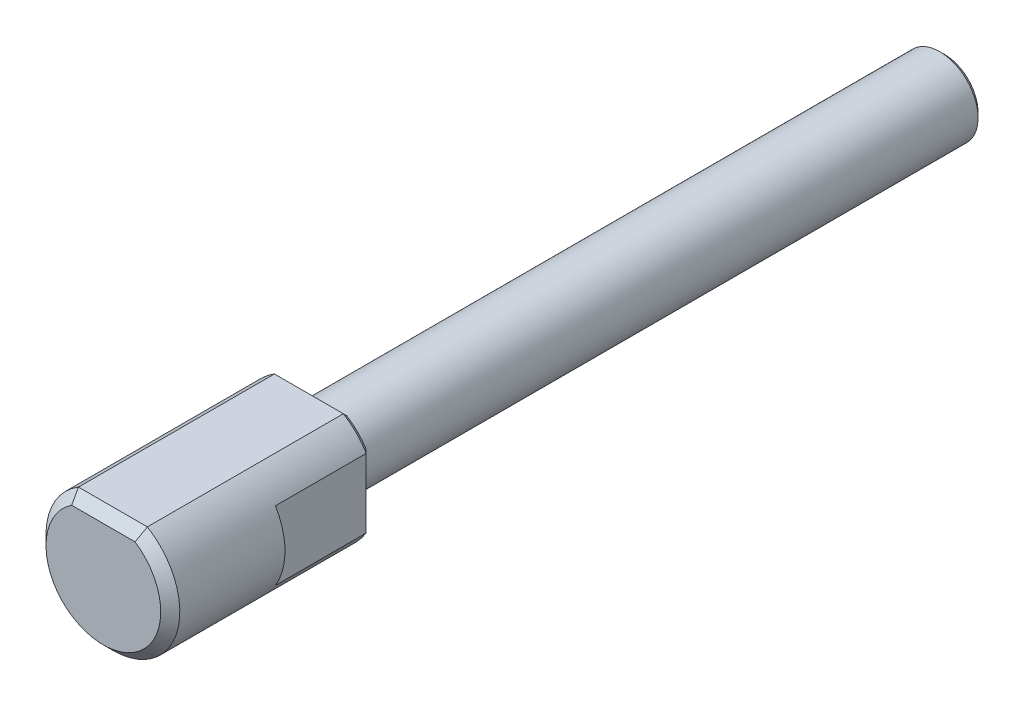
ISO-10303-21;
HEADER;
FILE_DESCRIPTION(('STEP AP214'),'2;1');
FILE_NAME('part.step','',(''),(''),'','','');
FILE_SCHEMA(('AUTOMOTIVE_DESIGN { 1 0 10303 214 1 1 1 1 }'));
ENDSEC;
DATA;
#1=APPLICATION_CONTEXT('core data for automotive mechanical design processes');
#2=APPLICATION_PROTOCOL_DEFINITION('international standard','automotive_design',2000,#1);
#3=PRODUCT_CONTEXT('',#1,'mechanical');
#4=PRODUCT('Part','Part','',(#3));
#5=PRODUCT_RELATED_PRODUCT_CATEGORY('part','',(#4));
#6=PRODUCT_DEFINITION_FORMATION('','',#4);
#7=PRODUCT_DEFINITION_CONTEXT('part definition',#1,'design');
#8=PRODUCT_DEFINITION('design','',#6,#7);
#9=PRODUCT_DEFINITION_SHAPE('','',#8);
#10=(LENGTH_UNIT() NAMED_UNIT(*) SI_UNIT(.MILLI.,.METRE.));
#11=(NAMED_UNIT(*) PLANE_ANGLE_UNIT() SI_UNIT($,.RADIAN.));
#12=(NAMED_UNIT(*) SI_UNIT($,.STERADIAN.) SOLID_ANGLE_UNIT());
#13=UNCERTAINTY_MEASURE_WITH_UNIT(LENGTH_MEASURE(1.E-05),#10,'distance_accuracy_value','');
#14=(GEOMETRIC_REPRESENTATION_CONTEXT(3) GLOBAL_UNCERTAINTY_ASSIGNED_CONTEXT((#13)) GLOBAL_UNIT_ASSIGNED_CONTEXT((#10,
#11,#12)) REPRESENTATION_CONTEXT('',''));
#15=CARTESIAN_POINT('',(0.,0.,0.));
#16=DIRECTION('',(0.,0.,1.));
#17=DIRECTION('',(1.,0.,0.));
#18=AXIS2_PLACEMENT_3D('',#15,#16,#17);
#19=CARTESIAN_POINT('',(0.,0.,76.));
#20=DIRECTION('',(0.,0.,1.));
#21=DIRECTION('',(1.,0.,0.));
#22=AXIS2_PLACEMENT_3D('',#19,#20,#21);
#23=PLANE('',#22);
#24=DIRECTION('',(0.,1.,0.));
#25=VECTOR('',#24,1.);
#26=CARTESIAN_POINT('',(-6.,3.60555127546399,76.));
#27=LINE('',#26,#25);
#28=CARTESIAN_POINT('',(-6.,-3.60555127546399,76.));
#29=VERTEX_POINT('',#28);
#30=CARTESIAN_POINT('',(-6.,3.60555127546399,76.));
#31=VERTEX_POINT('',#30);
#32=EDGE_CURVE('E148',#29,#31,#27,.T.);
#33=ORIENTED_EDGE('',*,*,#32,.F.);
#34=CARTESIAN_POINT('',(0.,0.,76.));
#35=DIRECTION('',(0.,0.,1.));
#36=DIRECTION('',(1.,0.,0.));
#37=AXIS2_PLACEMENT_3D('',#34,#35,#36);
#38=CIRCLE('',#37,7.);
#39=EDGE_CURVE('E142',#31,#29,#38,.T.);
#40=ORIENTED_EDGE('',*,*,#39,.F.);
#41=EDGE_LOOP('',(#33,#40));
#42=FACE_BOUND('',#41,.T.);
#43=ADVANCED_FACE('F33',(#42),#23,.F.);
#44=DIRECTION('',(-1.,0.,0.));
#45=VECTOR('',#44,1.);
#46=CARTESIAN_POINT('',(-3.60555127546399,-6.,76.));
#47=LINE('',#46,#45);
#48=CARTESIAN_POINT('',(3.60555127546399,-6.,76.));
#49=VERTEX_POINT('',#48);
#50=CARTESIAN_POINT('',(-3.60555127546399,-6.,76.));
#51=VERTEX_POINT('',#50);
#52=EDGE_CURVE('E144',#49,#51,#47,.T.);
#53=ORIENTED_EDGE('',*,*,#52,.F.);
#54=EDGE_CURVE('E140',#51,#49,#38,.T.);
#55=ORIENTED_EDGE('',*,*,#54,.F.);
#56=EDGE_LOOP('',(#53,#55));
#57=FACE_BOUND('',#56,.T.);
#58=ADVANCED_FACE('F285',(#57),#23,.F.);
#59=DIRECTION('',(0.,-1.,0.));
#60=VECTOR('',#59,1.);
#61=CARTESIAN_POINT('',(6.,-3.60555127546399,76.));
#62=LINE('',#61,#60);
#63=CARTESIAN_POINT('',(6.,3.60555127546399,76.));
#64=VERTEX_POINT('',#63);
#65=CARTESIAN_POINT('',(6.,-3.60555127546399,76.));
#66=VERTEX_POINT('',#65);
#67=EDGE_CURVE('E139',#64,#66,#62,.T.);
#68=ORIENTED_EDGE('',*,*,#67,.F.);
#69=EDGE_CURVE('E131',#66,#64,#38,.T.);
#70=ORIENTED_EDGE('',*,*,#69,.F.);
#71=EDGE_LOOP('',(#68,#70));
#72=FACE_BOUND('',#71,.T.);
#73=ADVANCED_FACE('F138',(#72),#23,.F.);
#74=CARTESIAN_POINT('',(0.,0.,76.));
#75=DIRECTION('',(0.,0.,1.));
#76=DIRECTION('',(1.,0.,0.));
#77=AXIS2_PLACEMENT_3D('',#74,#75,#76);
#78=CYLINDRICAL_SURFACE('',#77,7.);
#79=DIRECTION('',(0.,0.,1.));
#80=VECTOR('',#79,1.);
#81=CARTESIAN_POINT('',(-6.,-3.60555127546399,66.));
#82=LINE('',#81,#80);
#83=CARTESIAN_POINT('',(-6.,-3.60555127546399,66.5));
#84=VERTEX_POINT('',#83);
#85=EDGE_CURVE('E158',#84,#29,#82,.T.);
#86=ORIENTED_EDGE('',*,*,#85,.F.);
#87=CARTESIAN_POINT('',(0.,0.,66.5));
#88=DIRECTION('',(0.,0.,-1.));
#89=DIRECTION('',(-1.,0.,0.));
#90=AXIS2_PLACEMENT_3D('',#87,#88,#89);
#91=CIRCLE('',#90,7.);
#92=CARTESIAN_POINT('',(-3.60555127546399,-6.,66.5));
#93=VERTEX_POINT('',#92);
#94=EDGE_CURVE('E333',#84,#93,#91,.F.);
#95=ORIENTED_EDGE('',*,*,#94,.T.);
#96=DIRECTION('',(0.,0.,1.));
#97=VECTOR('',#96,1.);
#98=CARTESIAN_POINT('',(-3.60555127546399,-6.,66.));
#99=LINE('',#98,#97);
#100=EDGE_CURVE('E160',#93,#51,#99,.T.);
#101=ORIENTED_EDGE('',*,*,#100,.T.);
#102=ORIENTED_EDGE('',*,*,#54,.T.);
#103=DIRECTION('',(0.,0.,1.));
#104=VECTOR('',#103,1.);
#105=CARTESIAN_POINT('',(3.60555127546399,-6.,66.));
#106=LINE('',#105,#104);
#107=CARTESIAN_POINT('',(3.60555127546399,-6.,66.5));
#108=VERTEX_POINT('',#107);
#109=EDGE_CURVE('E134',#108,#49,#106,.T.);
#110=ORIENTED_EDGE('',*,*,#109,.F.);
#111=CARTESIAN_POINT('',(0.,0.,66.5));
#112=DIRECTION('',(0.,0.,-1.));
#113=DIRECTION('',(-1.,0.,0.));
#114=AXIS2_PLACEMENT_3D('',#111,#112,#113);
#115=CIRCLE('',#114,7.);
#116=CARTESIAN_POINT('',(6.,-3.60555127546399,66.5));
#117=VERTEX_POINT('',#116);
#118=EDGE_CURVE('E56',#108,#117,#115,.F.);
#119=ORIENTED_EDGE('',*,*,#118,.T.);
#120=DIRECTION('',(0.,0.,1.));
#121=VECTOR('',#120,1.);
#122=CARTESIAN_POINT('',(6.,-3.60555127546399,66.));
#123=LINE('',#122,#121);
#124=EDGE_CURVE('E127',#117,#66,#123,.T.);
#125=ORIENTED_EDGE('',*,*,#124,.T.);
#126=ORIENTED_EDGE('',*,*,#69,.T.);
#127=DIRECTION('',(0.,0.,1.));
#128=VECTOR('',#127,1.);
#129=CARTESIAN_POINT('',(6.,3.60555127546399,66.));
#130=LINE('',#129,#128);
#131=CARTESIAN_POINT('',(6.,3.60555127546399,66.5));
#132=VERTEX_POINT('',#131);
#133=EDGE_CURVE('E133',#132,#64,#130,.T.);
#134=ORIENTED_EDGE('',*,*,#133,.F.);
#135=CARTESIAN_POINT('',(0.,0.,66.5));
#136=DIRECTION('',(0.,0.,-1.));
#137=DIRECTION('',(-1.,0.,0.));
#138=AXIS2_PLACEMENT_3D('',#135,#136,#137);
#139=CIRCLE('',#138,7.);
#140=CARTESIAN_POINT('',(3.60555127546399,6.,66.5));
#141=VERTEX_POINT('',#140);
#142=EDGE_CURVE('E323',#132,#141,#139,.F.);
#143=ORIENTED_EDGE('',*,*,#142,.T.);
#144=DIRECTION('',(0.,0.,1.));
#145=VECTOR('',#144,1.);
#146=CARTESIAN_POINT('',(3.60555127546399,6.,76.));
#147=LINE('',#146,#145);
#148=CARTESIAN_POINT('',(3.60555127546399,6.,87.));
#149=VERTEX_POINT('',#148);
#150=EDGE_CURVE('E167',#141,#149,#147,.T.);
#151=ORIENTED_EDGE('',*,*,#150,.T.);
#152=CARTESIAN_POINT('',(0.,0.,87.));
#153=DIRECTION('',(0.,0.,1.));
#154=DIRECTION('',(1.,0.,0.));
#155=AXIS2_PLACEMENT_3D('',#152,#153,#154);
#156=CIRCLE('',#155,7.);
#157=CARTESIAN_POINT('',(-3.60555127546399,6.,87.));
#158=VERTEX_POINT('',#157);
#159=EDGE_CURVE('E176',#149,#158,#156,.F.);
#160=ORIENTED_EDGE('',*,*,#159,.T.);
#161=DIRECTION('',(0.,0.,1.));
#162=VECTOR('',#161,1.);
#163=CARTESIAN_POINT('',(-3.60555127546399,6.,76.));
#164=LINE('',#163,#162);
#165=CARTESIAN_POINT('',(-3.60555127546399,6.,66.5));
#166=VERTEX_POINT('',#165);
#167=EDGE_CURVE('E164',#166,#158,#164,.T.);
#168=ORIENTED_EDGE('',*,*,#167,.F.);
#169=CARTESIAN_POINT('',(0.,0.,66.5));
#170=DIRECTION('',(0.,0.,-1.));
#171=DIRECTION('',(-1.,0.,0.));
#172=AXIS2_PLACEMENT_3D('',#169,#170,#171);
#173=CIRCLE('',#172,7.);
#174=CARTESIAN_POINT('',(-6.,3.60555127546399,66.5));
#175=VERTEX_POINT('',#174);
#176=EDGE_CURVE('E336',#166,#175,#173,.F.);
#177=ORIENTED_EDGE('',*,*,#176,.T.);
#178=DIRECTION('',(0.,0.,1.));
#179=VECTOR('',#178,1.);
#180=CARTESIAN_POINT('',(-6.,3.60555127546399,66.));
#181=LINE('',#180,#179);
#182=EDGE_CURVE('E156',#175,#31,#181,.T.);
#183=ORIENTED_EDGE('',*,*,#182,.T.);
#184=ORIENTED_EDGE('',*,*,#39,.T.);
#185=EDGE_LOOP('',(#86,#95,#101,#102,#110,#119,#125,#126,#134,#143,#151,#160,#168,#177,#183,#184));
#186=FACE_BOUND('',#185,.T.);
#187=ADVANCED_FACE('F130',(#186),#78,.T.);
#188=CARTESIAN_POINT('',(3.60555127546399,6.,76.));
#189=DIRECTION('',(0.,1.,0.));
#190=DIRECTION('',(0.,0.,1.));
#191=AXIS2_PLACEMENT_3D('',#188,#189,#190);
#192=PLANE('',#191);
#193=ORIENTED_EDGE('',*,*,#150,.F.);
#194=DIRECTION('',(-1.,0.,0.));
#195=VECTOR('',#194,1.);
#196=CARTESIAN_POINT('',(3.60555127546399,6.,66.5));
#197=LINE('',#196,#195);
#198=EDGE_CURVE('E325',#141,#166,#197,.T.);
#199=ORIENTED_EDGE('',*,*,#198,.T.);
#200=ORIENTED_EDGE('',*,*,#167,.T.);
#201=DIRECTION('',(1.,0.,0.));
#202=VECTOR('',#201,1.);
#203=CARTESIAN_POINT('',(3.60555127546399,6.,87.));
#204=LINE('',#203,#202);
#205=EDGE_CURVE('E179',#158,#149,#204,.T.);
#206=ORIENTED_EDGE('',*,*,#205,.T.);
#207=EDGE_LOOP('',(#193,#199,#200,#206));
#208=FACE_BOUND('',#207,.T.);
#209=ADVANCED_FACE('F299',(#208),#192,.T.);
#210=CARTESIAN_POINT('',(0.,0.,88.));
#211=DIRECTION('',(0.,0.,1.));
#212=DIRECTION('',(1.,0.,0.));
#213=AXIS2_PLACEMENT_3D('',#210,#211,#212);
#214=PLANE('',#213);
#215=DIRECTION('',(-1.,0.,0.));
#216=VECTOR('',#215,1.);
#217=CARTESIAN_POINT('',(0.,4.99999999999999,88.));
#218=LINE('',#217,#216);
#219=CARTESIAN_POINT('',(3.3166247903554,4.99999999999999,88.));
#220=VERTEX_POINT('',#219);
#221=CARTESIAN_POINT('',(-3.3166247903554,4.99999999999999,88.));
#222=VERTEX_POINT('',#221);
#223=EDGE_CURVE('E171',#220,#222,#218,.T.);
#224=ORIENTED_EDGE('',*,*,#223,.T.);
#225=CARTESIAN_POINT('',(0.,0.,88.));
#226=DIRECTION('',(0.,0.,1.));
#227=DIRECTION('',(1.,0.,0.));
#228=AXIS2_PLACEMENT_3D('',#225,#226,#227);
#229=CIRCLE('',#228,5.99999999999999);
#230=EDGE_CURVE('E173',#222,#220,#229,.T.);
#231=ORIENTED_EDGE('',*,*,#230,.T.);
#232=EDGE_LOOP('',(#224,#231));
#233=FACE_BOUND('',#232,.T.);
#234=ADVANCED_FACE('F303',(#233),#214,.T.);
#235=CARTESIAN_POINT('',(6.,-3.60555127546399,66.));
#236=DIRECTION('',(-1.,0.,0.));
#237=DIRECTION('',(0.,0.,1.));
#238=AXIS2_PLACEMENT_3D('',#235,#236,#237);
#239=PLANE('',#238);
#240=ORIENTED_EDGE('',*,*,#124,.F.);
#241=DIRECTION('',(0.,1.,0.));
#242=VECTOR('',#241,1.);
#243=CARTESIAN_POINT('',(6.,3.60555127546399,66.5));
#244=LINE('',#243,#242);
#245=EDGE_CURVE('E48',#117,#132,#244,.T.);
#246=ORIENTED_EDGE('',*,*,#245,.T.);
#247=ORIENTED_EDGE('',*,*,#133,.T.);
#248=ORIENTED_EDGE('',*,*,#67,.T.);
#249=EDGE_LOOP('',(#240,#246,#247,#248));
#250=FACE_BOUND('',#249,.T.);
#251=ADVANCED_FACE('F143',(#250),#239,.F.);
#252=CARTESIAN_POINT('',(-3.60555127546399,-6.,66.));
#253=DIRECTION('',(0.,1.,0.));
#254=DIRECTION('',(0.,0.,1.));
#255=AXIS2_PLACEMENT_3D('',#252,#253,#254);
#256=PLANE('',#255);
#257=ORIENTED_EDGE('',*,*,#100,.F.);
#258=DIRECTION('',(1.,0.,0.));
#259=VECTOR('',#258,1.);
#260=CARTESIAN_POINT('',(3.60555127546399,-6.,66.5));
#261=LINE('',#260,#259);
#262=EDGE_CURVE('E327',#93,#108,#261,.T.);
#263=ORIENTED_EDGE('',*,*,#262,.T.);
#264=ORIENTED_EDGE('',*,*,#109,.T.);
#265=ORIENTED_EDGE('',*,*,#52,.T.);
#266=EDGE_LOOP('',(#257,#263,#264,#265));
#267=FACE_BOUND('',#266,.T.);
#268=ADVANCED_FACE('F311',(#267),#256,.F.);
#269=CARTESIAN_POINT('',(-6.,3.60555127546399,66.));
#270=DIRECTION('',(1.,0.,0.));
#271=DIRECTION('',(0.,0.,-1.));
#272=AXIS2_PLACEMENT_3D('',#269,#270,#271);
#273=PLANE('',#272);
#274=ORIENTED_EDGE('',*,*,#182,.F.);
#275=DIRECTION('',(0.,-1.,0.));
#276=VECTOR('',#275,1.);
#277=CARTESIAN_POINT('',(-6.,-3.60555127546399,66.5));
#278=LINE('',#277,#276);
#279=EDGE_CURVE('E331',#175,#84,#278,.T.);
#280=ORIENTED_EDGE('',*,*,#279,.T.);
#281=ORIENTED_EDGE('',*,*,#85,.T.);
#282=ORIENTED_EDGE('',*,*,#32,.T.);
#283=EDGE_LOOP('',(#274,#280,#281,#282));
#284=FACE_BOUND('',#283,.T.);
#285=ADVANCED_FACE('F383',(#284),#273,.F.);
#286=CARTESIAN_POINT('',(0.,0.,66.));
#287=DIRECTION('',(0.,0.,-1.));
#288=DIRECTION('',(-1.,0.,0.));
#289=AXIS2_PLACEMENT_3D('',#286,#287,#288);
#290=PLANE('',#289);
#291=DIRECTION('',(-1.,0.,0.));
#292=VECTOR('',#291,1.);
#293=CARTESIAN_POINT('',(-3.60555127546399,-5.5,66.));
#294=LINE('',#293,#292);
#295=CARTESIAN_POINT('',(3.4641016151378,-5.49999999999997,66.));
#296=VERTEX_POINT('',#295);
#297=CARTESIAN_POINT('',(-3.4641016151378,-5.5,66.));
#298=VERTEX_POINT('',#297);
#299=EDGE_CURVE('E347',#296,#298,#294,.T.);
#300=ORIENTED_EDGE('',*,*,#299,.T.);
#301=CARTESIAN_POINT('',(0.,0.,66.));
#302=DIRECTION('',(0.,0.,-1.));
#303=DIRECTION('',(-1.,0.,0.));
#304=AXIS2_PLACEMENT_3D('',#301,#302,#303);
#305=CIRCLE('',#304,6.5);
#306=CARTESIAN_POINT('',(-5.5,-3.4641016151378,66.));
#307=VERTEX_POINT('',#306);
#308=EDGE_CURVE('E340',#298,#307,#305,.T.);
#309=ORIENTED_EDGE('',*,*,#308,.T.);
#310=DIRECTION('',(0.,1.,0.));
#311=VECTOR('',#310,1.);
#312=CARTESIAN_POINT('',(-5.5,3.60555127546399,66.));
#313=LINE('',#312,#311);
#314=CARTESIAN_POINT('',(-5.49999999999997,3.4641016151378,66.));
#315=VERTEX_POINT('',#314);
#316=EDGE_CURVE('E343',#307,#315,#313,.T.);
#317=ORIENTED_EDGE('',*,*,#316,.T.);
#318=CARTESIAN_POINT('',(0.,0.,66.));
#319=DIRECTION('',(0.,0.,-1.));
#320=DIRECTION('',(-1.,0.,0.));
#321=AXIS2_PLACEMENT_3D('',#318,#319,#320);
#322=CIRCLE('',#321,6.5);
#323=CARTESIAN_POINT('',(-3.4641016151378,5.5,66.));
#324=VERTEX_POINT('',#323);
#325=EDGE_CURVE('E345',#315,#324,#322,.T.);
#326=ORIENTED_EDGE('',*,*,#325,.T.);
#327=DIRECTION('',(1.,0.,0.));
#328=VECTOR('',#327,1.);
#329=CARTESIAN_POINT('',(0.,5.5,66.));
#330=LINE('',#329,#328);
#331=CARTESIAN_POINT('',(3.4641016151378,5.5,66.));
#332=VERTEX_POINT('',#331);
#333=EDGE_CURVE('E182',#324,#332,#330,.T.);
#334=ORIENTED_EDGE('',*,*,#333,.T.);
#335=CARTESIAN_POINT('',(0.,0.,66.));
#336=DIRECTION('',(0.,0.,-1.));
#337=DIRECTION('',(-1.,0.,0.));
#338=AXIS2_PLACEMENT_3D('',#335,#336,#337);
#339=CIRCLE('',#338,6.5);
#340=CARTESIAN_POINT('',(5.49999999999997,3.4641016151378,66.));
#341=VERTEX_POINT('',#340);
#342=EDGE_CURVE('E353',#332,#341,#339,.T.);
#343=ORIENTED_EDGE('',*,*,#342,.T.);
#344=DIRECTION('',(0.,-1.,0.));
#345=VECTOR('',#344,1.);
#346=CARTESIAN_POINT('',(5.5,-3.60555127546399,66.));
#347=LINE('',#346,#345);
#348=CARTESIAN_POINT('',(5.5,-3.4641016151378,66.));
#349=VERTEX_POINT('',#348);
#350=EDGE_CURVE('E351',#341,#349,#347,.T.);
#351=ORIENTED_EDGE('',*,*,#350,.T.);
#352=CARTESIAN_POINT('',(0.,0.,66.));
#353=DIRECTION('',(0.,0.,-1.));
#354=DIRECTION('',(-1.,0.,0.));
#355=AXIS2_PLACEMENT_3D('',#352,#353,#354);
#356=CIRCLE('',#355,6.5);
#357=EDGE_CURVE('E349',#349,#296,#356,.T.);
#358=ORIENTED_EDGE('',*,*,#357,.T.);
#359=EDGE_LOOP('',(#300,#309,#317,#326,#334,#343,#351,#358));
#360=FACE_BOUND('',#359,.T.);
#361=CARTESIAN_POINT('',(0.,0.,66.));
#362=DIRECTION('',(0.,0.,-1.));
#363=DIRECTION('',(-1.,0.,0.));
#364=AXIS2_PLACEMENT_3D('',#361,#362,#363);
#365=CIRCLE('',#364,4.);
#366=CARTESIAN_POINT('',(-4.,0.,66.));
#367=VERTEX_POINT('',#366);
#368=EDGE_CURVE('E166',#367,#367,#365,.T.);
#369=ORIENTED_EDGE('',*,*,#368,.F.);
#370=EDGE_LOOP('',(#369));
#371=FACE_BOUND('',#370,.T.);
#372=ADVANCED_FACE('F357',(#360,#371),#290,.T.);
#373=CARTESIAN_POINT('',(0.,0.,66.));
#374=DIRECTION('',(0.,0.,-1.));
#375=DIRECTION('',(-1.,0.,0.));
#376=AXIS2_PLACEMENT_3D('',#373,#374,#375);
#377=CYLINDRICAL_SURFACE('',#376,4.);
#378=CARTESIAN_POINT('',(0.,0.,0.5));
#379=DIRECTION('',(0.,0.,-1.));
#380=DIRECTION('',(-1.,0.,0.));
#381=AXIS2_PLACEMENT_3D('',#378,#379,#380);
#382=CIRCLE('',#381,4.);
#383=CARTESIAN_POINT('',(-4.,0.,0.5));
#384=VERTEX_POINT('',#383);
#385=EDGE_CURVE('E11',#384,#384,#382,.F.);
#386=ORIENTED_EDGE('',*,*,#385,.T.);
#387=EDGE_LOOP('',(#386));
#388=FACE_BOUND('',#387,.T.);
#389=ORIENTED_EDGE('',*,*,#368,.T.);
#390=EDGE_LOOP('',(#389));
#391=FACE_BOUND('',#390,.T.);
#392=ADVANCED_FACE('F400',(#388,#391),#377,.T.);
#393=CARTESIAN_POINT('',(0.,0.,0.));
#394=DIRECTION('',(0.,0.,-1.));
#395=DIRECTION('',(-1.,0.,0.));
#396=AXIS2_PLACEMENT_3D('',#393,#394,#395);
#397=PLANE('',#396);
#398=CARTESIAN_POINT('',(0.,0.,0.));
#399=DIRECTION('',(0.,0.,-1.));
#400=DIRECTION('',(-1.,0.,0.));
#401=AXIS2_PLACEMENT_3D('',#398,#399,#400);
#402=CIRCLE('',#401,3.5);
#403=CARTESIAN_POINT('',(-3.5,0.,0.));
#404=VERTEX_POINT('',#403);
#405=EDGE_CURVE('E41',#404,#404,#402,.T.);
#406=ORIENTED_EDGE('',*,*,#405,.T.);
#407=EDGE_LOOP('',(#406));
#408=FACE_BOUND('',#407,.T.);
#409=ADVANCED_FACE('F403',(#408),#397,.T.);
#410=CARTESIAN_POINT('',(0.,4.99999999999999,88.));
#411=DIRECTION('',(0.,-0.707106781186547,-0.707106781186547));
#412=DIRECTION('',(-1.,0.,0.));
#413=AXIS2_PLACEMENT_3D('',#410,#411,#412);
#414=PLANE('',#413);
#415=CARTESIAN_POINT('',(3.3166247903554,4.99999999999999,88.));
#416=CARTESIAN_POINT('',(3.36670789308575,5.16638826578631,87.8336117342137));
#417=CARTESIAN_POINT('',(3.41582668132424,5.33291583956722,87.6670841604328));
#418=CARTESIAN_POINT('',(3.51213550472372,5.66624917361855,87.3337508263814));
#419=CARTESIAN_POINT('',(3.55932554485475,5.83305493317097,87.166945066829));
#420=CARTESIAN_POINT('',(3.60555127546399,6.,87.));
#421=B_SPLINE_CURVE_WITH_KNOTS('',3,(#415,#416,#417,#418,#419,#420),.UNSPECIFIED.,.F.,.F.,(4,2,
4),(0.,0.721719952024737,1.44343804418097),.UNSPECIFIED.);
#422=EDGE_CURVE('E151',#149,#220,#421,.F.);
#423=ORIENTED_EDGE('',*,*,#422,.F.);
#424=ORIENTED_EDGE('',*,*,#205,.F.);
#425=CARTESIAN_POINT('',(-3.60555127546399,6.,87.));
#426=CARTESIAN_POINT('',(-3.55932554485475,5.83305493317097,87.166945066829));
#427=CARTESIAN_POINT('',(-3.51213550472371,5.66624917361855,87.3337508263814));
#428=CARTESIAN_POINT('',(-3.41582668132424,5.33291583956722,87.6670841604328));
#429=CARTESIAN_POINT('',(-3.36670789308574,5.16638826578631,87.8336117342137));
#430=CARTESIAN_POINT('',(-3.31662479035539,4.99999999999999,88.));
#431=B_SPLINE_CURVE_WITH_KNOTS('',3,(#425,#426,#427,#428,#429,#430),.UNSPECIFIED.,.F.,.F.,(4,2,
4),(0.,0.721718092156235,1.44343804418097),.UNSPECIFIED.);
#432=EDGE_CURVE('E145',#222,#158,#431,.F.);
#433=ORIENTED_EDGE('',*,*,#432,.F.);
#434=ORIENTED_EDGE('',*,*,#223,.F.);
#435=EDGE_LOOP('',(#423,#424,#433,#434));
#436=FACE_BOUND('',#435,.T.);
#437=ADVANCED_FACE('F193',(#436),#414,.F.);
#438=CARTESIAN_POINT('',(0.,0.,88.));
#439=DIRECTION('',(0.,0.,-1.));
#440=DIRECTION('',(-1.,0.,0.));
#441=AXIS2_PLACEMENT_3D('',#438,#439,#440);
#442=CONICAL_SURFACE('',#441,5.99999999999999,0.785398163397448);
#443=ORIENTED_EDGE('',*,*,#432,.T.);
#444=ORIENTED_EDGE('',*,*,#159,.F.);
#445=ORIENTED_EDGE('',*,*,#422,.T.);
#446=ORIENTED_EDGE('',*,*,#230,.F.);
#447=EDGE_LOOP('',(#443,#444,#445,#446));
#448=FACE_BOUND('',#447,.T.);
#449=ADVANCED_FACE('F196',(#448),#442,.T.);
#450=CARTESIAN_POINT('',(0.,0.,66.));
#451=DIRECTION('',(0.,0.,1.));
#452=DIRECTION('',(1.,0.,0.));
#453=AXIS2_PLACEMENT_3D('',#450,#451,#452);
#454=CONICAL_SURFACE('',#453,6.5,0.785398163397447);
#455=CARTESIAN_POINT('',(3.60555127546399,6.,66.5));
#456=CARTESIAN_POINT('',(3.58242983209274,5.9166025311282,66.4166025311282));
#457=CARTESIAN_POINT('',(3.55908164036078,5.83323713573496,66.3332371357349));
#458=CARTESIAN_POINT('',(3.51193175370977,5.66657046905069,66.1665704690507));
#459=CARTESIAN_POINT('',(3.48813005866635,5.58326919777726,66.0832691977773));
#460=CARTESIAN_POINT('',(3.46410161513784,5.49999999999998,66.));
#461=B_SPLINE_CURVE_WITH_KNOTS('',3,(#455,#456,#457,#458,#459,#460),.UNSPECIFIED.,.F.,.F.,(4,2,
4),(0.,0.36055852118299,0.721117141252334),.UNSPECIFIED.);
#462=EDGE_CURVE('E266',#141,#332,#461,.T.);
#463=ORIENTED_EDGE('',*,*,#462,.F.);
#464=ORIENTED_EDGE('',*,*,#142,.F.);
#465=CARTESIAN_POINT('',(6.,3.60555127546399,66.5));
#466=CARTESIAN_POINT('',(5.9166025311282,3.58242983209274,66.4166025311282));
#467=CARTESIAN_POINT('',(5.83323713573496,3.55908164036078,66.3332371357349));
#468=CARTESIAN_POINT('',(5.6665704690507,3.51193175370977,66.1665704690507));
#469=CARTESIAN_POINT('',(5.58326919777727,3.48813005866635,66.0832691977773));
#470=CARTESIAN_POINT('',(5.5,3.46410161513784,66.));
#471=B_SPLINE_CURVE_WITH_KNOTS('',3,(#465,#466,#467,#468,#469,#470),.UNSPECIFIED.,.F.,.F.,(4,2,
4),(0.,0.360558521182989,0.721117141252314),.UNSPECIFIED.);
#472=EDGE_CURVE('E188',#341,#132,#471,.F.);
#473=ORIENTED_EDGE('',*,*,#472,.F.);
#474=ORIENTED_EDGE('',*,*,#342,.F.);
#475=EDGE_LOOP('',(#463,#464,#473,#474));
#476=FACE_BOUND('',#475,.T.);
#477=ADVANCED_FACE('F200',(#476),#454,.T.);
#478=CARTESIAN_POINT('',(5.5,0.,66.));
#479=DIRECTION('',(0.707106781186547,0.,-0.707106781186547));
#480=DIRECTION('',(0.,1.,0.));
#481=AXIS2_PLACEMENT_3D('',#478,#479,#480);
#482=PLANE('',#481);
#483=ORIENTED_EDGE('',*,*,#472,.T.);
#484=ORIENTED_EDGE('',*,*,#245,.F.);
#485=CARTESIAN_POINT('',(6.,-3.60555127546399,66.5));
#486=CARTESIAN_POINT('',(5.9166025311282,-3.58242983209274,66.4166025311282));
#487=CARTESIAN_POINT('',(5.83323713573496,-3.55908164036078,66.3332371357349));
#488=CARTESIAN_POINT('',(5.66657046905069,-3.51193175370977,66.1665704690507));
#489=CARTESIAN_POINT('',(5.58326919777726,-3.48813005866635,66.0832691977773));
#490=CARTESIAN_POINT('',(5.49999999999998,-3.46410161513783,66.));
#491=B_SPLINE_CURVE_WITH_KNOTS('',3,(#485,#486,#487,#488,#489,#490),.UNSPECIFIED.,.F.,.F.,(4,2,
4),(0.,0.36055852118299,0.721117141252335),.UNSPECIFIED.);
#492=EDGE_CURVE('E253',#349,#117,#491,.F.);
#493=ORIENTED_EDGE('',*,*,#492,.F.);
#494=ORIENTED_EDGE('',*,*,#350,.F.);
#495=EDGE_LOOP('',(#483,#484,#493,#494));
#496=FACE_BOUND('',#495,.T.);
#497=ADVANCED_FACE('F262',(#496),#482,.T.);
#498=CARTESIAN_POINT('',(0.,5.5,66.));
#499=DIRECTION('',(0.,-0.707106781186547,0.707106781186547));
#500=DIRECTION('',(1.,0.,0.));
#501=AXIS2_PLACEMENT_3D('',#498,#499,#500);
#502=PLANE('',#501);
#503=ORIENTED_EDGE('',*,*,#462,.T.);
#504=ORIENTED_EDGE('',*,*,#333,.F.);
#505=CARTESIAN_POINT('',(-3.4641016151378,5.49999999999997,66.));
#506=CARTESIAN_POINT('',(-3.48813005866632,5.58326919777726,66.0832691977773));
#507=CARTESIAN_POINT('',(-3.51193175370975,5.66657046905069,66.1665704690507));
#508=CARTESIAN_POINT('',(-3.5590816403608,5.83323713573496,66.3332371357349));
#509=CARTESIAN_POINT('',(-3.58242983209279,5.91660253112819,66.4166025311282));
#510=CARTESIAN_POINT('',(-3.60555127546408,5.99999999999999,66.5));
#511=B_SPLINE_CURVE_WITH_KNOTS('',3,(#505,#506,#507,#508,#509,#510),.UNSPECIFIED.,.F.,.F.,(4,2,
4),(0.,0.360558620069348,0.721117141252337),.UNSPECIFIED.);
#512=EDGE_CURVE('E247',#166,#324,#511,.F.);
#513=ORIENTED_EDGE('',*,*,#512,.F.);
#514=ORIENTED_EDGE('',*,*,#198,.F.);
#515=EDGE_LOOP('',(#503,#504,#513,#514));
#516=FACE_BOUND('',#515,.T.);
#517=ADVANCED_FACE('F259',(#516),#502,.F.);
#518=CARTESIAN_POINT('',(0.,0.,66.));
#519=DIRECTION('',(0.,0.,1.));
#520=DIRECTION('',(1.,0.,0.));
#521=AXIS2_PLACEMENT_3D('',#518,#519,#520);
#522=CONICAL_SURFACE('',#521,6.5,0.785398163397448);
#523=ORIENTED_EDGE('',*,*,#492,.T.);
#524=ORIENTED_EDGE('',*,*,#118,.F.);
#525=CARTESIAN_POINT('',(3.60555127546399,-6.,66.5));
#526=CARTESIAN_POINT('',(3.58242983209274,-5.9166025311282,66.4166025311282));
#527=CARTESIAN_POINT('',(3.55908164036078,-5.83323713573496,66.3332371357349));
#528=CARTESIAN_POINT('',(3.51193175370977,-5.6665704690507,66.1665704690507));
#529=CARTESIAN_POINT('',(3.48813005866635,-5.58326919777727,66.0832691977773));
#530=CARTESIAN_POINT('',(3.46410161513784,-5.5,66.));
#531=B_SPLINE_CURVE_WITH_KNOTS('',3,(#525,#526,#527,#528,#529,#530),.UNSPECIFIED.,.F.,.F.,(4,2,
4),(0.,0.360558521182989,0.721117141252314),.UNSPECIFIED.);
#532=EDGE_CURVE('E228',#296,#108,#531,.F.);
#533=ORIENTED_EDGE('',*,*,#532,.F.);
#534=ORIENTED_EDGE('',*,*,#357,.F.);
#535=EDGE_LOOP('',(#523,#524,#533,#534));
#536=FACE_BOUND('',#535,.T.);
#537=ADVANCED_FACE('F241',(#536),#522,.T.);
#538=CARTESIAN_POINT('',(0.,0.,66.));
#539=DIRECTION('',(0.,0.,1.));
#540=DIRECTION('',(1.,0.,0.));
#541=AXIS2_PLACEMENT_3D('',#538,#539,#540);
#542=CONICAL_SURFACE('',#541,6.5,0.785398163397447);
#543=ORIENTED_EDGE('',*,*,#512,.T.);
#544=ORIENTED_EDGE('',*,*,#325,.F.);
#545=CARTESIAN_POINT('',(-5.5,3.46410161513782,66.));
#546=CARTESIAN_POINT('',(-5.58326919777728,3.48813005866633,66.0832691977773));
#547=CARTESIAN_POINT('',(-5.66657046905071,3.51193175370975,66.1665704690507));
#548=CARTESIAN_POINT('',(-5.83323713573496,3.5590816403608,66.333237135735));
#549=CARTESIAN_POINT('',(-5.9166025311282,3.58242983209279,66.4166025311282));
#550=CARTESIAN_POINT('',(-5.99999999999999,3.60555127546408,66.5));
#551=B_SPLINE_CURVE_WITH_KNOTS('',3,(#545,#546,#547,#548,#549,#550),.UNSPECIFIED.,.F.,.F.,(4,2,
4),(0.,0.360558620069343,0.721117141252328),.UNSPECIFIED.);
#552=EDGE_CURVE('E221',#175,#315,#551,.F.);
#553=ORIENTED_EDGE('',*,*,#552,.F.);
#554=ORIENTED_EDGE('',*,*,#176,.F.);
#555=EDGE_LOOP('',(#543,#544,#553,#554));
#556=FACE_BOUND('',#555,.T.);
#557=ADVANCED_FACE('F238',(#556),#542,.T.);
#558=CARTESIAN_POINT('',(0.,-5.5,66.));
#559=DIRECTION('',(0.,-0.707106781186547,-0.707106781186547));
#560=DIRECTION('',(1.,0.,0.));
#561=AXIS2_PLACEMENT_3D('',#558,#559,#560);
#562=PLANE('',#561);
#563=ORIENTED_EDGE('',*,*,#532,.T.);
#564=ORIENTED_EDGE('',*,*,#262,.F.);
#565=CARTESIAN_POINT('',(-3.60555127546399,-6.,66.5));
#566=CARTESIAN_POINT('',(-3.58242983209274,-5.9166025311282,66.4166025311282));
#567=CARTESIAN_POINT('',(-3.55908164036078,-5.83323713573496,66.3332371357349));
#568=CARTESIAN_POINT('',(-3.51193175370977,-5.66657046905069,66.1665704690507));
#569=CARTESIAN_POINT('',(-3.48813005866635,-5.58326919777726,66.0832691977773));
#570=CARTESIAN_POINT('',(-3.46410161513783,-5.49999999999998,66.));
#571=B_SPLINE_CURVE_WITH_KNOTS('',3,(#565,#566,#567,#568,#569,#570),.UNSPECIFIED.,.F.,.F.,(4,2,
4),(0.,0.36055852118299,0.721117141252335),.UNSPECIFIED.);
#572=EDGE_CURVE('E229',#298,#93,#571,.F.);
#573=ORIENTED_EDGE('',*,*,#572,.F.);
#574=ORIENTED_EDGE('',*,*,#299,.F.);
#575=EDGE_LOOP('',(#563,#564,#573,#574));
#576=FACE_BOUND('',#575,.T.);
#577=ADVANCED_FACE('F208',(#576),#562,.T.);
#578=CARTESIAN_POINT('',(-5.5,0.,66.));
#579=DIRECTION('',(-0.707106781186547,0.,-0.707106781186547));
#580=DIRECTION('',(0.,-1.,0.));
#581=AXIS2_PLACEMENT_3D('',#578,#579,#580);
#582=PLANE('',#581);
#583=ORIENTED_EDGE('',*,*,#552,.T.);
#584=ORIENTED_EDGE('',*,*,#316,.F.);
#585=CARTESIAN_POINT('',(-5.49999999999997,-3.4641016151378,66.));
#586=CARTESIAN_POINT('',(-5.58326919777726,-3.48813005866631,66.0832691977773));
#587=CARTESIAN_POINT('',(-5.66657046905069,-3.51193175370974,66.1665704690507));
#588=CARTESIAN_POINT('',(-5.83323713573495,-3.5590816403608,66.3332371357349));
#589=CARTESIAN_POINT('',(-5.91660253112819,-3.58242983209279,66.4166025311282));
#590=CARTESIAN_POINT('',(-5.99999999999999,-3.60555127546408,66.5));
#591=B_SPLINE_CURVE_WITH_KNOTS('',3,(#585,#586,#587,#588,#589,#590),.UNSPECIFIED.,.F.,.F.,(4,2,
4),(0.,0.360558620069348,0.721117141252338),.UNSPECIFIED.);
#592=EDGE_CURVE('E214',#84,#307,#591,.F.);
#593=ORIENTED_EDGE('',*,*,#592,.F.);
#594=ORIENTED_EDGE('',*,*,#279,.F.);
#595=EDGE_LOOP('',(#583,#584,#593,#594));
#596=FACE_BOUND('',#595,.T.);
#597=ADVANCED_FACE('F202',(#596),#582,.T.);
#598=CARTESIAN_POINT('',(0.,0.,66.));
#599=DIRECTION('',(0.,0.,1.));
#600=DIRECTION('',(1.,0.,0.));
#601=AXIS2_PLACEMENT_3D('',#598,#599,#600);
#602=CONICAL_SURFACE('',#601,6.5,0.785398163397449);
#603=ORIENTED_EDGE('',*,*,#572,.T.);
#604=ORIENTED_EDGE('',*,*,#94,.F.);
#605=ORIENTED_EDGE('',*,*,#592,.T.);
#606=ORIENTED_EDGE('',*,*,#308,.F.);
#607=EDGE_LOOP('',(#603,#604,#605,#606));
#608=FACE_BOUND('',#607,.T.);
#609=ADVANCED_FACE('F207',(#608),#602,.T.);
#610=CARTESIAN_POINT('',(0.,0.,0.));
#611=DIRECTION('',(0.,0.,1.));
#612=DIRECTION('',(1.,0.,0.));
#613=AXIS2_PLACEMENT_3D('',#610,#611,#612);
#614=CONICAL_SURFACE('',#613,3.5,0.785398163397445);
#615=ORIENTED_EDGE('',*,*,#385,.F.);
#616=EDGE_LOOP('',(#615));
#617=FACE_BOUND('',#616,.T.);
#618=ORIENTED_EDGE('',*,*,#405,.F.);
#619=EDGE_LOOP('',(#618));
#620=FACE_BOUND('',#619,.T.);
#621=ADVANCED_FACE('F35',(#617,#620),#614,.T.);
#622=CLOSED_SHELL('',(#43,#58,#73,#187,#209,#234,#251,#268,#285,#372,#392,#409,#437,#449,#477,
#497,#517,#537,#557,#577,#597,#609,#621));
#623=MANIFOLD_SOLID_BREP('B2',#622);
#624=ADVANCED_BREP_SHAPE_REPRESENTATION('',(#18,#623),#14);
#625=SHAPE_DEFINITION_REPRESENTATION(#9,#624);
ENDSEC;
END-ISO-10303-21;
